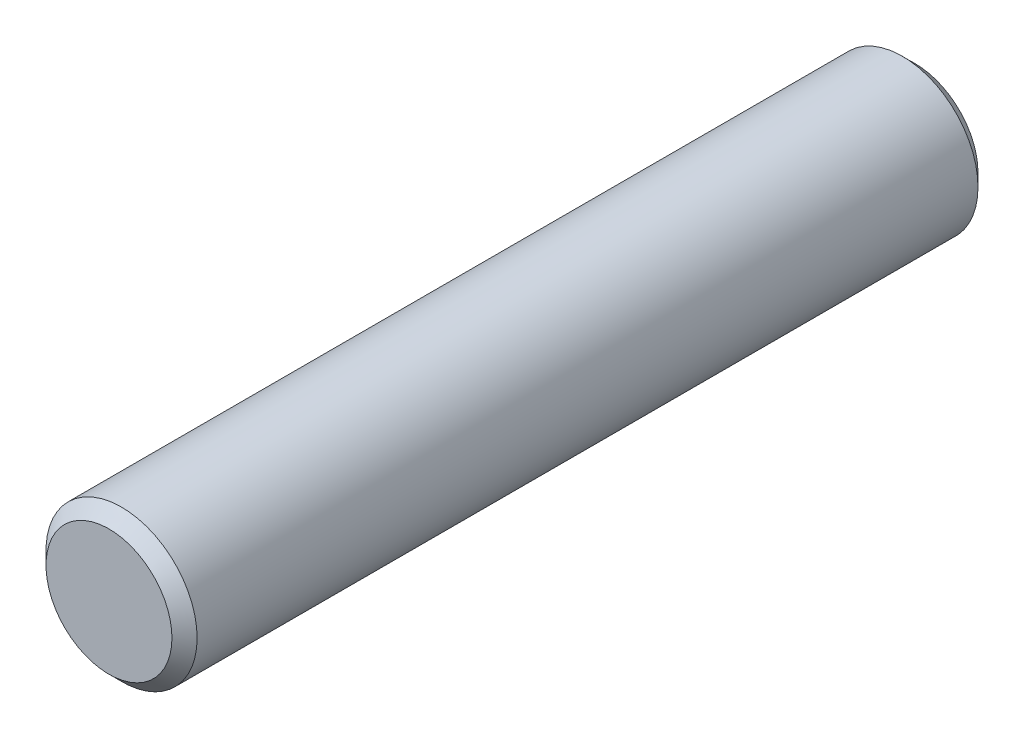
ISO-10303-21;
HEADER;
FILE_DESCRIPTION(('STEP AP214'),'2;1');
FILE_NAME('part.step','',(''),(''),'','','');
FILE_SCHEMA(('AUTOMOTIVE_DESIGN { 1 0 10303 214 1 1 1 1 }'));
ENDSEC;
DATA;
#1=APPLICATION_CONTEXT('core data for automotive mechanical design processes');
#2=APPLICATION_PROTOCOL_DEFINITION('international standard','automotive_design',2000,#1);
#3=PRODUCT_CONTEXT('',#1,'mechanical');
#4=PRODUCT('Part','Part','',(#3));
#5=PRODUCT_RELATED_PRODUCT_CATEGORY('part','',(#4));
#6=PRODUCT_DEFINITION_FORMATION('','',#4);
#7=PRODUCT_DEFINITION_CONTEXT('part definition',#1,'design');
#8=PRODUCT_DEFINITION('design','',#6,#7);
#9=PRODUCT_DEFINITION_SHAPE('','',#8);
#10=(LENGTH_UNIT() NAMED_UNIT(*) SI_UNIT(.MILLI.,.METRE.));
#11=(NAMED_UNIT(*) PLANE_ANGLE_UNIT() SI_UNIT($,.RADIAN.));
#12=(NAMED_UNIT(*) SI_UNIT($,.STERADIAN.) SOLID_ANGLE_UNIT());
#13=UNCERTAINTY_MEASURE_WITH_UNIT(LENGTH_MEASURE(1.E-05),#10,'distance_accuracy_value','');
#14=(GEOMETRIC_REPRESENTATION_CONTEXT(3) GLOBAL_UNCERTAINTY_ASSIGNED_CONTEXT((#13)) GLOBAL_UNIT_ASSIGNED_CONTEXT((#10,
#11,#12)) REPRESENTATION_CONTEXT('',''));
#15=CARTESIAN_POINT('',(0.,0.,0.));
#16=DIRECTION('',(0.,0.,1.));
#17=DIRECTION('',(1.,0.,0.));
#18=AXIS2_PLACEMENT_3D('',#15,#16,#17);
#19=CARTESIAN_POINT('',(0.,0.,32.));
#20=DIRECTION('',(0.,0.,-1.));
#21=DIRECTION('',(-1.,0.,0.));
#22=AXIS2_PLACEMENT_3D('',#19,#20,#21);
#23=CYLINDRICAL_SURFACE('',#22,3.);
#24=CARTESIAN_POINT('',(0.,0.,0.5));
#25=DIRECTION('',(0.,0.,1.));
#26=DIRECTION('',(1.,0.,0.));
#27=AXIS2_PLACEMENT_3D('',#24,#25,#26);
#28=CIRCLE('',#27,3.);
#29=CARTESIAN_POINT('',(3.,0.,0.5));
#30=VERTEX_POINT('',#29);
#31=EDGE_CURVE('E45',#30,#30,#28,.T.);
#32=ORIENTED_EDGE('',*,*,#31,.T.);
#33=EDGE_LOOP('',(#32));
#34=FACE_BOUND('',#33,.T.);
#35=CARTESIAN_POINT('',(0.,0.,31.5));
#36=DIRECTION('',(0.,0.,1.));
#37=DIRECTION('',(1.,0.,0.));
#38=AXIS2_PLACEMENT_3D('',#35,#36,#37);
#39=CIRCLE('',#38,3.);
#40=CARTESIAN_POINT('',(3.,0.,31.5));
#41=VERTEX_POINT('',#40);
#42=EDGE_CURVE('E49',#41,#41,#39,.F.);
#43=ORIENTED_EDGE('',*,*,#42,.T.);
#44=EDGE_LOOP('',(#43));
#45=FACE_BOUND('',#44,.T.);
#46=ADVANCED_FACE('F34',(#34,#45),#23,.T.);
#47=CARTESIAN_POINT('',(0.,0.,32.));
#48=DIRECTION('',(0.,0.,1.));
#49=DIRECTION('',(1.,0.,0.));
#50=AXIS2_PLACEMENT_3D('',#47,#48,#49);
#51=PLANE('',#50);
#52=CARTESIAN_POINT('',(0.,0.,32.));
#53=DIRECTION('',(0.,0.,1.));
#54=DIRECTION('',(1.,0.,0.));
#55=AXIS2_PLACEMENT_3D('',#52,#53,#54);
#56=CIRCLE('',#55,2.5);
#57=CARTESIAN_POINT('',(2.5,0.,32.));
#58=VERTEX_POINT('',#57);
#59=EDGE_CURVE('E10',#58,#58,#56,.T.);
#60=ORIENTED_EDGE('',*,*,#59,.T.);
#61=EDGE_LOOP('',(#60));
#62=FACE_BOUND('',#61,.T.);
#63=ADVANCED_FACE('F65',(#62),#51,.T.);
#64=CARTESIAN_POINT('',(0.,0.,0.));
#65=DIRECTION('',(0.,0.,1.));
#66=DIRECTION('',(1.,0.,0.));
#67=AXIS2_PLACEMENT_3D('',#64,#65,#66);
#68=PLANE('',#67);
#69=CARTESIAN_POINT('',(0.,0.,0.));
#70=DIRECTION('',(0.,0.,1.));
#71=DIRECTION('',(1.,0.,0.));
#72=AXIS2_PLACEMENT_3D('',#69,#70,#71);
#73=CIRCLE('',#72,2.5);
#74=CARTESIAN_POINT('',(2.5,0.,0.));
#75=VERTEX_POINT('',#74);
#76=EDGE_CURVE('E41',#75,#75,#73,.F.);
#77=ORIENTED_EDGE('',*,*,#76,.T.);
#78=EDGE_LOOP('',(#77));
#79=FACE_BOUND('',#78,.T.);
#80=ADVANCED_FACE('F62',(#79),#68,.F.);
#81=CARTESIAN_POINT('',(0.,0.,0.5));
#82=DIRECTION('',(0.,0.,1.));
#83=DIRECTION('',(1.,0.,0.));
#84=AXIS2_PLACEMENT_3D('',#81,#82,#83);
#85=CONICAL_SURFACE('',#84,3.,0.785398163397452);
#86=ORIENTED_EDGE('',*,*,#76,.F.);
#87=EDGE_LOOP('',(#86));
#88=FACE_BOUND('',#87,.T.);
#89=ORIENTED_EDGE('',*,*,#31,.F.);
#90=EDGE_LOOP('',(#89));
#91=FACE_BOUND('',#90,.T.);
#92=ADVANCED_FACE('F58',(#88,#91),#85,.T.);
#93=CARTESIAN_POINT('',(0.,0.,32.));
#94=DIRECTION('',(0.,0.,-1.));
#95=DIRECTION('',(-1.,0.,0.));
#96=AXIS2_PLACEMENT_3D('',#93,#94,#95);
#97=CONICAL_SURFACE('',#96,2.5,0.785398163397441);
#98=ORIENTED_EDGE('',*,*,#42,.F.);
#99=EDGE_LOOP('',(#98));
#100=FACE_BOUND('',#99,.T.);
#101=ORIENTED_EDGE('',*,*,#59,.F.);
#102=EDGE_LOOP('',(#101));
#103=FACE_BOUND('',#102,.T.);
#104=ADVANCED_FACE('F36',(#100,#103),#97,.T.);
#105=CLOSED_SHELL('',(#46,#63,#80,#92,#104));
#106=MANIFOLD_SOLID_BREP('B2',#105);
#107=ADVANCED_BREP_SHAPE_REPRESENTATION('',(#18,#106),#14);
#108=SHAPE_DEFINITION_REPRESENTATION(#9,#107);
ENDSEC;
END-ISO-10303-21;
